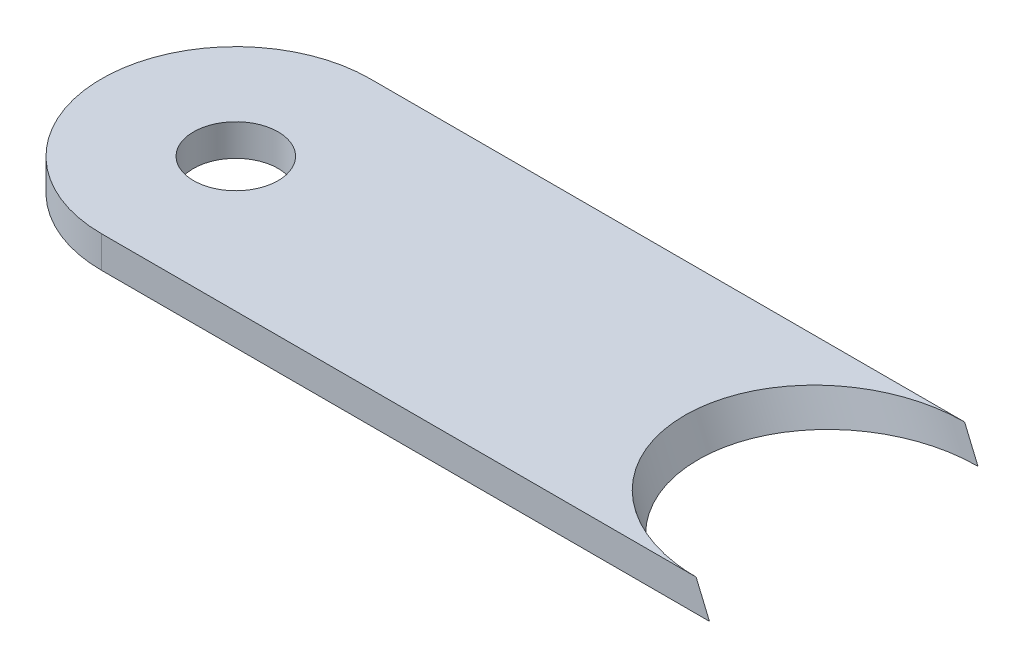
ISO-10303-21;
HEADER;
FILE_DESCRIPTION(('STEP AP214'),'2;1');
FILE_NAME('part.step','',(''),(''),'','','');
FILE_SCHEMA(('AUTOMOTIVE_DESIGN { 1 0 10303 214 1 1 1 1 }'));
ENDSEC;
DATA;
#1=APPLICATION_CONTEXT('core data for automotive mechanical design processes');
#2=APPLICATION_PROTOCOL_DEFINITION('international standard','automotive_design',2000,#1);
#3=PRODUCT_CONTEXT('',#1,'mechanical');
#4=PRODUCT('Part','Part','',(#3));
#5=PRODUCT_RELATED_PRODUCT_CATEGORY('part','',(#4));
#6=PRODUCT_DEFINITION_FORMATION('','',#4);
#7=PRODUCT_DEFINITION_CONTEXT('part definition',#1,'design');
#8=PRODUCT_DEFINITION('design','',#6,#7);
#9=PRODUCT_DEFINITION_SHAPE('','',#8);
#10=(LENGTH_UNIT() NAMED_UNIT(*) SI_UNIT(.MILLI.,.METRE.));
#11=(NAMED_UNIT(*) PLANE_ANGLE_UNIT() SI_UNIT($,.RADIAN.));
#12=(NAMED_UNIT(*) SI_UNIT($,.STERADIAN.) SOLID_ANGLE_UNIT());
#13=UNCERTAINTY_MEASURE_WITH_UNIT(LENGTH_MEASURE(1.E-05),#10,'distance_accuracy_value','');
#14=(GEOMETRIC_REPRESENTATION_CONTEXT(3) GLOBAL_UNCERTAINTY_ASSIGNED_CONTEXT((#13)) GLOBAL_UNIT_ASSIGNED_CONTEXT((#10,
#11,#12)) REPRESENTATION_CONTEXT('',''));
#15=CARTESIAN_POINT('',(0.,0.,0.));
#16=DIRECTION('',(0.,0.,1.));
#17=DIRECTION('',(1.,0.,0.));
#18=AXIS2_PLACEMENT_3D('',#15,#16,#17);
#19=CARTESIAN_POINT('',(-177.49621968125,280.000004224693,-692.700000000018));
#20=DIRECTION('',(0.,0.,-1.));
#21=DIRECTION('',(-1.,0.,0.));
#22=AXIS2_PLACEMENT_3D('',#19,#20,#21);
#23=PLANE('',#22);
#24=DIRECTION('',(-1.,0.,0.));
#25=VECTOR('',#24,1.);
#26=CARTESIAN_POINT('',(-177.49621968125,283.000004224693,-692.700000000018));
#27=LINE('',#26,#25);
#28=CARTESIAN_POINT('',(-178.76177313755,283.000002732918,-692.700000000017));
#29=VERTEX_POINT('',#28);
#30=CARTESIAN_POINT('',(-234.999999999999,283.000001408231,-692.700000000006));
#31=VERTEX_POINT('',#30);
#32=EDGE_CURVE('E180',#29,#31,#27,.T.);
#33=ORIENTED_EDGE('',*,*,#32,.F.);
#34=DIRECTION('',(-0.388682016439568,0.9213719607718,0.));
#35=VECTOR('',#34,1.);
#36=CARTESIAN_POINT('',(-110.000000000005,120.,-692.700000000018));
#37=LINE('',#36,#35);
#38=CARTESIAN_POINT('',(-177.49621968125,280.000004224693,-692.700000000017));
#39=VERTEX_POINT('',#38);
#40=EDGE_CURVE('E110',#29,#39,#37,.F.);
#41=ORIENTED_EDGE('',*,*,#40,.T.);
#42=DIRECTION('',(-1.,0.,0.));
#43=VECTOR('',#42,1.);
#44=CARTESIAN_POINT('',(-177.49621968125,280.000004224693,-692.700000000018));
#45=LINE('',#44,#43);
#46=CARTESIAN_POINT('',(-234.999999999999,280.000001408231,-692.700000000006));
#47=VERTEX_POINT('',#46);
#48=EDGE_CURVE('E179',#39,#47,#45,.T.);
#49=ORIENTED_EDGE('',*,*,#48,.T.);
#50=DIRECTION('',(0.,1.,0.));
#51=VECTOR('',#50,1.);
#52=CARTESIAN_POINT('',(-234.999999999999,280.,-692.700000000001));
#53=LINE('',#52,#51);
#54=EDGE_CURVE('E155',#47,#31,#53,.T.);
#55=ORIENTED_EDGE('',*,*,#54,.T.);
#56=EDGE_LOOP('',(#33,#41,#49,#55));
#57=FACE_BOUND('',#56,.T.);
#58=ADVANCED_FACE('F93',(#57),#23,.T.);
#59=CARTESIAN_POINT('',(-177.49621968125,280.000004224693,-667.300000000018));
#60=DIRECTION('',(0.,0.,-1.));
#61=DIRECTION('',(-1.,0.,0.));
#62=AXIS2_PLACEMENT_3D('',#59,#60,#61);
#63=PLANE('',#62);
#64=DIRECTION('',(-0.388682016439568,0.9213719607718,0.));
#65=VECTOR('',#64,1.);
#66=CARTESIAN_POINT('',(-110.000000000005,120.,-667.300000000018));
#67=LINE('',#66,#65);
#68=CARTESIAN_POINT('',(-178.761773747246,283.000004178204,-667.300000000017));
#69=VERTEX_POINT('',#68);
#70=CARTESIAN_POINT('',(-177.49621968125,280.000004224693,-667.300000000017));
#71=VERTEX_POINT('',#70);
#72=EDGE_CURVE('E103',#69,#71,#67,.F.);
#73=ORIENTED_EDGE('',*,*,#72,.F.);
#74=DIRECTION('',(-0.999999999999999,-3.6734045182809E-08,0.));
#75=VECTOR('',#74,1.);
#76=CARTESIAN_POINT('',(-177.49621968125,283.000004224693,-667.300000000018));
#77=LINE('',#76,#75);
#78=CARTESIAN_POINT('',(-234.999999999999,283.000001408231,-667.300000000012));
#79=VERTEX_POINT('',#78);
#80=EDGE_CURVE('E147',#69,#79,#77,.T.);
#81=ORIENTED_EDGE('',*,*,#80,.T.);
#82=DIRECTION('',(0.,1.,0.));
#83=VECTOR('',#82,1.);
#84=CARTESIAN_POINT('',(-234.999999999999,280.000002112347,-667.300000000018));
#85=LINE('',#84,#83);
#86=CARTESIAN_POINT('',(-234.999999999999,280.000001408231,-667.300000000012));
#87=VERTEX_POINT('',#86);
#88=EDGE_CURVE('E144',#87,#79,#85,.T.);
#89=ORIENTED_EDGE('',*,*,#88,.F.);
#90=DIRECTION('',(-0.999999999999999,-3.6734045182809E-08,0.));
#91=VECTOR('',#90,1.);
#92=CARTESIAN_POINT('',(-177.49621968125,280.000004224693,-667.300000000018));
#93=LINE('',#92,#91);
#94=EDGE_CURVE('E131',#71,#87,#93,.T.);
#95=ORIENTED_EDGE('',*,*,#94,.F.);
#96=EDGE_LOOP('',(#73,#81,#89,#95));
#97=FACE_BOUND('',#96,.T.);
#98=ADVANCED_FACE('F145',(#97),#63,.F.);
#99=CARTESIAN_POINT('',(-1.74313107729476E-05,283.000059299163,-1.8366537804331E-05));
#100=DIRECTION('',(-6.22546681474921E-08,0.999999999999996,-6.55947639807725E-08));
#101=DIRECTION('',(0.,6.55947639807726E-08,0.999999999999998));
#102=AXIS2_PLACEMENT_3D('',#99,#100,#101);
#103=PLANE('',#102);
#104=ORIENTED_EDGE('',*,*,#80,.F.);
#105=CARTESIAN_POINT('',(-178.761773488974,283.000003565971,-680.000000000017));
#106=DIRECTION('',(-6.22546681474921E-08,0.999999999999996,-6.55947639807725E-08));
#107=DIRECTION('',(-0.999999999999986,-6.22546579479891E-08,1.5549262929788E-07));
#108=AXIS2_PLACEMENT_3D('',#105,#106,#107);
#109=ELLIPSE('',#108,13.783792222016,12.7000000000001);
#110=EDGE_CURVE('E182',#69,#29,#109,.F.);
#111=ORIENTED_EDGE('',*,*,#110,.T.);
#112=ORIENTED_EDGE('',*,*,#32,.T.);
#113=CARTESIAN_POINT('',(-234.999999999999,283.,-680.));
#114=DIRECTION('',(0.,1.,0.));
#115=DIRECTION('',(0.,0.,1.));
#116=AXIS2_PLACEMENT_3D('',#113,#114,#115);
#117=CIRCLE('',#116,12.7000000000005);
#118=EDGE_CURVE('E168',#31,#79,#117,.T.);
#119=ORIENTED_EDGE('',*,*,#118,.T.);
#120=EDGE_LOOP('',(#104,#111,#112,#119));
#121=FACE_BOUND('',#120,.T.);
#122=CARTESIAN_POINT('',(-234.999999999999,283.,-680.));
#123=DIRECTION('',(0.,-1.,0.));
#124=DIRECTION('',(0.,0.,-1.));
#125=AXIS2_PLACEMENT_3D('',#122,#123,#124);
#126=CIRCLE('',#125,3.99999999999999);
#127=CARTESIAN_POINT('',(-234.999999999999,283.,-684.));
#128=VERTEX_POINT('',#127);
#129=EDGE_CURVE('E141',#128,#128,#126,.T.);
#130=ORIENTED_EDGE('',*,*,#129,.T.);
#131=EDGE_LOOP('',(#130));
#132=FACE_BOUND('',#131,.T.);
#133=ADVANCED_FACE('F195',(#121,#132),#103,.T.);
#134=CARTESIAN_POINT('',(-1.74313107729476E-05,280.000059299163,-1.8366537804331E-05));
#135=DIRECTION('',(-6.22546681474921E-08,0.999999999999996,-6.55947639807725E-08));
#136=DIRECTION('',(0.,6.55947639807726E-08,0.999999999999998));
#137=AXIS2_PLACEMENT_3D('',#134,#135,#136);
#138=PLANE('',#137);
#139=CARTESIAN_POINT('',(-177.496219436603,280.000003644758,-680.000000000017));
#140=DIRECTION('',(-6.22546681474921E-08,0.999999999999996,-6.55947639807725E-08));
#141=DIRECTION('',(-0.999999999999986,-6.22546579479891E-08,1.5549262929788E-07));
#142=AXIS2_PLACEMENT_3D('',#139,#140,#141);
#143=ELLIPSE('',#142,13.783792222016,12.7000000000001);
#144=EDGE_CURVE('E12',#71,#39,#143,.F.);
#145=ORIENTED_EDGE('',*,*,#144,.F.);
#146=ORIENTED_EDGE('',*,*,#94,.T.);
#147=CARTESIAN_POINT('',(-234.999999999999,280.,-680.));
#148=DIRECTION('',(0.,1.,0.));
#149=DIRECTION('',(0.,0.,1.));
#150=AXIS2_PLACEMENT_3D('',#147,#148,#149);
#151=CIRCLE('',#150,12.7000000000005);
#152=EDGE_CURVE('E137',#47,#87,#151,.T.);
#153=ORIENTED_EDGE('',*,*,#152,.F.);
#154=ORIENTED_EDGE('',*,*,#48,.F.);
#155=EDGE_LOOP('',(#145,#146,#153,#154));
#156=FACE_BOUND('',#155,.T.);
#157=CARTESIAN_POINT('',(-234.999999999999,280.,-680.));
#158=DIRECTION('',(0.,-1.,0.));
#159=DIRECTION('',(0.,0.,-1.));
#160=AXIS2_PLACEMENT_3D('',#157,#158,#159);
#161=CIRCLE('',#160,3.99999999999999);
#162=CARTESIAN_POINT('',(-234.999999999999,280.,-684.));
#163=VERTEX_POINT('',#162);
#164=EDGE_CURVE('E151',#163,#163,#161,.T.);
#165=ORIENTED_EDGE('',*,*,#164,.F.);
#166=EDGE_LOOP('',(#165));
#167=FACE_BOUND('',#166,.T.);
#168=ADVANCED_FACE('F133',(#156,#167),#138,.F.);
#169=CARTESIAN_POINT('',(-234.999999999999,280.,-680.));
#170=DIRECTION('',(0.,1.,0.));
#171=DIRECTION('',(0.,0.,1.));
#172=AXIS2_PLACEMENT_3D('',#169,#170,#171);
#173=CYLINDRICAL_SURFACE('',#172,12.7000000000005);
#174=ORIENTED_EDGE('',*,*,#118,.F.);
#175=ORIENTED_EDGE('',*,*,#54,.F.);
#176=ORIENTED_EDGE('',*,*,#152,.T.);
#177=ORIENTED_EDGE('',*,*,#88,.T.);
#178=EDGE_LOOP('',(#174,#175,#176,#177));
#179=FACE_BOUND('',#178,.T.);
#180=ADVANCED_FACE('F153',(#179),#173,.T.);
#181=CARTESIAN_POINT('',(-234.999999999999,280.,-680.));
#182=DIRECTION('',(0.,1.,0.));
#183=DIRECTION('',(0.,0.,1.));
#184=AXIS2_PLACEMENT_3D('',#181,#182,#183);
#185=CYLINDRICAL_SURFACE('',#184,3.99999999999999);
#186=ORIENTED_EDGE('',*,*,#164,.T.);
#187=EDGE_LOOP('',(#186));
#188=FACE_BOUND('',#187,.T.);
#189=ORIENTED_EDGE('',*,*,#129,.F.);
#190=EDGE_LOOP('',(#189));
#191=FACE_BOUND('',#190,.T.);
#192=ADVANCED_FACE('F212',(#188,#191),#185,.F.);
#193=CARTESIAN_POINT('',(-110.000000000005,120.,-680.000000000018));
#194=DIRECTION('',(-0.388682016439568,0.9213719607718,0.));
#195=DIRECTION('',(0.9213719607718,0.388682016439568,0.));
#196=AXIS2_PLACEMENT_3D('',#193,#194,#195);
#197=CYLINDRICAL_SURFACE('',#196,12.7000000000001);
#198=ORIENTED_EDGE('',*,*,#110,.F.);
#199=ORIENTED_EDGE('',*,*,#72,.T.);
#200=ORIENTED_EDGE('',*,*,#144,.T.);
#201=ORIENTED_EDGE('',*,*,#40,.F.);
#202=EDGE_LOOP('',(#198,#199,#200,#201));
#203=FACE_BOUND('',#202,.T.);
#204=ADVANCED_FACE('F95',(#203),#197,.F.);
#205=CLOSED_SHELL('',(#58,#98,#133,#168,#180,#192,#204));
#206=MANIFOLD_SOLID_BREP('B2',#205);
#207=ADVANCED_BREP_SHAPE_REPRESENTATION('',(#18,#206),#14);
#208=SHAPE_DEFINITION_REPRESENTATION(#9,#207);
ENDSEC;
END-ISO-10303-21;
